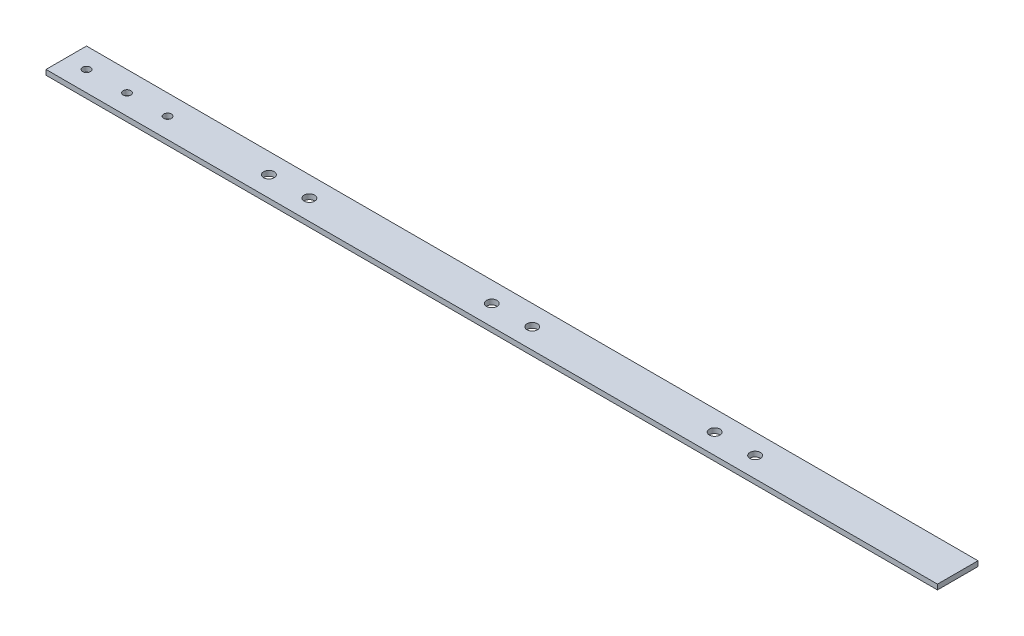
ISO-10303-21;
HEADER;
FILE_DESCRIPTION(('STEP AP214'),'2;1');
FILE_NAME('part.step','',(''),(''),'','','');
FILE_SCHEMA(('AUTOMOTIVE_DESIGN { 1 0 10303 214 1 1 1 1 }'));
ENDSEC;
DATA;
#1=APPLICATION_CONTEXT('core data for automotive mechanical design processes');
#2=APPLICATION_PROTOCOL_DEFINITION('international standard','automotive_design',2000,#1);
#3=PRODUCT_CONTEXT('',#1,'mechanical');
#4=PRODUCT('Part','Part','',(#3));
#5=PRODUCT_RELATED_PRODUCT_CATEGORY('part','',(#4));
#6=PRODUCT_DEFINITION_FORMATION('','',#4);
#7=PRODUCT_DEFINITION_CONTEXT('part definition',#1,'design');
#8=PRODUCT_DEFINITION('design','',#6,#7);
#9=PRODUCT_DEFINITION_SHAPE('','',#8);
#10=(LENGTH_UNIT() NAMED_UNIT(*) SI_UNIT(.MILLI.,.METRE.));
#11=(NAMED_UNIT(*) PLANE_ANGLE_UNIT() SI_UNIT($,.RADIAN.));
#12=(NAMED_UNIT(*) SI_UNIT($,.STERADIAN.) SOLID_ANGLE_UNIT());
#13=UNCERTAINTY_MEASURE_WITH_UNIT(LENGTH_MEASURE(1.E-05),#10,'distance_accuracy_value','');
#14=(GEOMETRIC_REPRESENTATION_CONTEXT(3) GLOBAL_UNCERTAINTY_ASSIGNED_CONTEXT((#13)) GLOBAL_UNIT_ASSIGNED_CONTEXT((#10,
#11,#12)) REPRESENTATION_CONTEXT('',''));
#15=CARTESIAN_POINT('',(0.,0.,0.));
#16=DIRECTION('',(0.,0.,1.));
#17=DIRECTION('',(1.,0.,0.));
#18=AXIS2_PLACEMENT_3D('',#15,#16,#17);
#19=CARTESIAN_POINT('',(279.4,3.175,-12.7));
#20=DIRECTION('',(-1.,0.,0.));
#21=DIRECTION('',(0.,0.,1.));
#22=AXIS2_PLACEMENT_3D('',#19,#20,#21);
#23=PLANE('',#22);
#24=DIRECTION('',(0.,0.,-1.));
#25=VECTOR('',#24,1.);
#26=CARTESIAN_POINT('',(279.4,0.,-12.7));
#27=LINE('',#26,#25);
#28=CARTESIAN_POINT('',(279.4,0.,12.7));
#29=VERTEX_POINT('',#28);
#30=CARTESIAN_POINT('',(279.4,0.,-12.7));
#31=VERTEX_POINT('',#30);
#32=EDGE_CURVE('E100',#29,#31,#27,.T.);
#33=ORIENTED_EDGE('',*,*,#32,.T.);
#34=DIRECTION('',(0.,-1.,0.));
#35=VECTOR('',#34,1.);
#36=CARTESIAN_POINT('',(279.4,3.175,-12.7));
#37=LINE('',#36,#35);
#38=CARTESIAN_POINT('',(279.4,3.175,-12.7));
#39=VERTEX_POINT('',#38);
#40=EDGE_CURVE('E11',#39,#31,#37,.T.);
#41=ORIENTED_EDGE('',*,*,#40,.F.);
#42=DIRECTION('',(0.,0.,-1.));
#43=VECTOR('',#42,1.);
#44=CARTESIAN_POINT('',(279.4,3.175,-12.7));
#45=LINE('',#44,#43);
#46=CARTESIAN_POINT('',(279.4,3.175,12.7));
#47=VERTEX_POINT('',#46);
#48=EDGE_CURVE('E88',#47,#39,#45,.T.);
#49=ORIENTED_EDGE('',*,*,#48,.F.);
#50=DIRECTION('',(0.,-1.,0.));
#51=VECTOR('',#50,1.);
#52=CARTESIAN_POINT('',(279.4,3.175,12.7));
#53=LINE('',#52,#51);
#54=EDGE_CURVE('E96',#47,#29,#53,.T.);
#55=ORIENTED_EDGE('',*,*,#54,.T.);
#56=EDGE_LOOP('',(#33,#41,#49,#55));
#57=FACE_BOUND('',#56,.T.);
#58=ADVANCED_FACE('F37',(#57),#23,.F.);
#59=CARTESIAN_POINT('',(-279.4,3.175,-12.7));
#60=DIRECTION('',(0.,0.,1.));
#61=DIRECTION('',(1.,0.,0.));
#62=AXIS2_PLACEMENT_3D('',#59,#60,#61);
#63=PLANE('',#62);
#64=DIRECTION('',(-1.,0.,0.));
#65=VECTOR('',#64,1.);
#66=CARTESIAN_POINT('',(-279.4,0.,-12.7));
#67=LINE('',#66,#65);
#68=CARTESIAN_POINT('',(-279.4,0.,-12.7));
#69=VERTEX_POINT('',#68);
#70=EDGE_CURVE('E92',#31,#69,#67,.T.);
#71=ORIENTED_EDGE('',*,*,#70,.T.);
#72=DIRECTION('',(0.,-1.,0.));
#73=VECTOR('',#72,1.);
#74=CARTESIAN_POINT('',(-279.4,3.175,-12.7));
#75=LINE('',#74,#73);
#76=CARTESIAN_POINT('',(-279.4,3.175,-12.7));
#77=VERTEX_POINT('',#76);
#78=EDGE_CURVE('E45',#77,#69,#75,.T.);
#79=ORIENTED_EDGE('',*,*,#78,.F.);
#80=DIRECTION('',(-1.,0.,0.));
#81=VECTOR('',#80,1.);
#82=CARTESIAN_POINT('',(-279.4,3.175,-12.7));
#83=LINE('',#82,#81);
#84=EDGE_CURVE('E83',#39,#77,#83,.T.);
#85=ORIENTED_EDGE('',*,*,#84,.F.);
#86=ORIENTED_EDGE('',*,*,#40,.T.);
#87=EDGE_LOOP('',(#71,#79,#85,#86));
#88=FACE_BOUND('',#87,.T.);
#89=ADVANCED_FACE('F91',(#88),#63,.F.);
#90=CARTESIAN_POINT('',(-279.4,3.175,-12.7));
#91=DIRECTION('',(1.,0.,0.));
#92=DIRECTION('',(0.,0.,-1.));
#93=AXIS2_PLACEMENT_3D('',#90,#91,#92);
#94=PLANE('',#93);
#95=DIRECTION('',(0.,0.,1.));
#96=VECTOR('',#95,1.);
#97=CARTESIAN_POINT('',(-279.4,0.,-12.7));
#98=LINE('',#97,#96);
#99=CARTESIAN_POINT('',(-279.4,0.,12.7));
#100=VERTEX_POINT('',#99);
#101=EDGE_CURVE('E70',#69,#100,#98,.T.);
#102=ORIENTED_EDGE('',*,*,#101,.T.);
#103=DIRECTION('',(0.,-1.,0.));
#104=VECTOR('',#103,1.);
#105=CARTESIAN_POINT('',(-279.4,3.175,12.7));
#106=LINE('',#105,#104);
#107=CARTESIAN_POINT('',(-279.4,3.175,12.7));
#108=VERTEX_POINT('',#107);
#109=EDGE_CURVE('E93',#108,#100,#106,.T.);
#110=ORIENTED_EDGE('',*,*,#109,.F.);
#111=DIRECTION('',(0.,0.,1.));
#112=VECTOR('',#111,1.);
#113=CARTESIAN_POINT('',(-279.4,3.175,-12.7));
#114=LINE('',#113,#112);
#115=EDGE_CURVE('E86',#77,#108,#114,.T.);
#116=ORIENTED_EDGE('',*,*,#115,.F.);
#117=ORIENTED_EDGE('',*,*,#78,.T.);
#118=EDGE_LOOP('',(#102,#110,#116,#117));
#119=FACE_BOUND('',#118,.T.);
#120=ADVANCED_FACE('F94',(#119),#94,.F.);
#121=CARTESIAN_POINT('',(-279.4,3.175,12.7));
#122=DIRECTION('',(0.,0.,-1.));
#123=DIRECTION('',(-1.,0.,0.));
#124=AXIS2_PLACEMENT_3D('',#121,#122,#123);
#125=PLANE('',#124);
#126=DIRECTION('',(1.,0.,0.));
#127=VECTOR('',#126,1.);
#128=CARTESIAN_POINT('',(-279.4,0.,12.7));
#129=LINE('',#128,#127);
#130=EDGE_CURVE('E76',#100,#29,#129,.T.);
#131=ORIENTED_EDGE('',*,*,#130,.T.);
#132=ORIENTED_EDGE('',*,*,#54,.F.);
#133=DIRECTION('',(1.,0.,0.));
#134=VECTOR('',#133,1.);
#135=CARTESIAN_POINT('',(-279.4,3.175,12.7));
#136=LINE('',#135,#134);
#137=EDGE_CURVE('E53',#108,#47,#136,.T.);
#138=ORIENTED_EDGE('',*,*,#137,.F.);
#139=ORIENTED_EDGE('',*,*,#109,.T.);
#140=EDGE_LOOP('',(#131,#132,#138,#139));
#141=FACE_BOUND('',#140,.T.);
#142=ADVANCED_FACE('F108',(#141),#125,.F.);
#143=CARTESIAN_POINT('',(0.,3.175,0.));
#144=DIRECTION('',(0.,1.,0.));
#145=DIRECTION('',(0.,0.,1.));
#146=AXIS2_PLACEMENT_3D('',#143,#144,#145);
#147=PLANE('',#146);
#148=CARTESIAN_POINT('',(-152.4,3.175,0.));
#149=DIRECTION('',(0.,1.,0.));
#150=DIRECTION('',(0.,0.,1.));
#151=AXIS2_PLACEMENT_3D('',#148,#149,#150);
#152=CIRCLE('',#151,3.30200000000001);
#153=CARTESIAN_POINT('',(-152.4,3.175,3.30200000000001));
#154=VERTEX_POINT('',#153);
#155=EDGE_CURVE('E162',#154,#154,#152,.T.);
#156=ORIENTED_EDGE('',*,*,#155,.F.);
#157=EDGE_LOOP('',(#156));
#158=FACE_BOUND('',#157,.T.);
#159=CARTESIAN_POINT('',(-127.,3.175,0.));
#160=DIRECTION('',(0.,1.,0.));
#161=DIRECTION('',(0.,0.,1.));
#162=AXIS2_PLACEMENT_3D('',#159,#160,#161);
#163=CIRCLE('',#162,3.302);
#164=CARTESIAN_POINT('',(-127.,3.175,3.302));
#165=VERTEX_POINT('',#164);
#166=EDGE_CURVE('E159',#165,#165,#163,.T.);
#167=ORIENTED_EDGE('',*,*,#166,.F.);
#168=EDGE_LOOP('',(#167));
#169=FACE_BOUND('',#168,.T.);
#170=CARTESIAN_POINT('',(-12.7,3.175,0.));
#171=DIRECTION('',(0.,1.,0.));
#172=DIRECTION('',(0.,0.,1.));
#173=AXIS2_PLACEMENT_3D('',#170,#171,#172);
#174=CIRCLE('',#173,3.302);
#175=CARTESIAN_POINT('',(-12.7,3.175,3.302));
#176=VERTEX_POINT('',#175);
#177=EDGE_CURVE('E153',#176,#176,#174,.T.);
#178=ORIENTED_EDGE('',*,*,#177,.F.);
#179=EDGE_LOOP('',(#178));
#180=FACE_BOUND('',#179,.T.);
#181=CARTESIAN_POINT('',(12.7,3.175,0.));
#182=DIRECTION('',(0.,1.,0.));
#183=DIRECTION('',(0.,0.,1.));
#184=AXIS2_PLACEMENT_3D('',#181,#182,#183);
#185=CIRCLE('',#184,3.302);
#186=CARTESIAN_POINT('',(12.7,3.175,3.302));
#187=VERTEX_POINT('',#186);
#188=EDGE_CURVE('E147',#187,#187,#185,.T.);
#189=ORIENTED_EDGE('',*,*,#188,.F.);
#190=EDGE_LOOP('',(#189));
#191=FACE_BOUND('',#190,.T.);
#192=CARTESIAN_POINT('',(127.,3.175,0.));
#193=DIRECTION('',(0.,1.,0.));
#194=DIRECTION('',(0.,0.,1.));
#195=AXIS2_PLACEMENT_3D('',#192,#193,#194);
#196=CIRCLE('',#195,3.30200000000001);
#197=CARTESIAN_POINT('',(127.,3.175,3.30200000000001));
#198=VERTEX_POINT('',#197);
#199=EDGE_CURVE('E141',#198,#198,#196,.T.);
#200=ORIENTED_EDGE('',*,*,#199,.F.);
#201=EDGE_LOOP('',(#200));
#202=FACE_BOUND('',#201,.T.);
#203=CARTESIAN_POINT('',(152.4,3.175,0.));
#204=DIRECTION('',(0.,1.,0.));
#205=DIRECTION('',(0.,0.,1.));
#206=AXIS2_PLACEMENT_3D('',#203,#204,#205);
#207=CIRCLE('',#206,3.30200000000001);
#208=CARTESIAN_POINT('',(152.4,3.175,3.30200000000001));
#209=VERTEX_POINT('',#208);
#210=EDGE_CURVE('E135',#209,#209,#207,.T.);
#211=ORIENTED_EDGE('',*,*,#210,.F.);
#212=EDGE_LOOP('',(#211));
#213=FACE_BOUND('',#212,.T.);
#214=CARTESIAN_POINT('',(-266.7,3.175,0.));
#215=DIRECTION('',(0.,1.,0.));
#216=DIRECTION('',(0.,0.,1.));
#217=AXIS2_PLACEMENT_3D('',#214,#215,#216);
#218=CIRCLE('',#217,2.413);
#219=CARTESIAN_POINT('',(-266.7,3.175,2.413));
#220=VERTEX_POINT('',#219);
#221=EDGE_CURVE('E127',#220,#220,#218,.T.);
#222=ORIENTED_EDGE('',*,*,#221,.F.);
#223=EDGE_LOOP('',(#222));
#224=FACE_BOUND('',#223,.T.);
#225=CARTESIAN_POINT('',(-241.3,3.175,0.));
#226=DIRECTION('',(0.,1.,0.));
#227=DIRECTION('',(0.,0.,1.));
#228=AXIS2_PLACEMENT_3D('',#225,#226,#227);
#229=CIRCLE('',#228,2.413);
#230=CARTESIAN_POINT('',(-241.3,3.175,2.413));
#231=VERTEX_POINT('',#230);
#232=EDGE_CURVE('E124',#231,#231,#229,.T.);
#233=ORIENTED_EDGE('',*,*,#232,.F.);
#234=EDGE_LOOP('',(#233));
#235=FACE_BOUND('',#234,.T.);
#236=CARTESIAN_POINT('',(-215.9,3.175,0.));
#237=DIRECTION('',(0.,1.,0.));
#238=DIRECTION('',(0.,0.,1.));
#239=AXIS2_PLACEMENT_3D('',#236,#237,#238);
#240=CIRCLE('',#239,2.413);
#241=CARTESIAN_POINT('',(-215.9,3.175,2.413));
#242=VERTEX_POINT('',#241);
#243=EDGE_CURVE('E117',#242,#242,#240,.T.);
#244=ORIENTED_EDGE('',*,*,#243,.F.);
#245=EDGE_LOOP('',(#244));
#246=FACE_BOUND('',#245,.T.);
#247=ORIENTED_EDGE('',*,*,#48,.T.);
#248=ORIENTED_EDGE('',*,*,#84,.T.);
#249=ORIENTED_EDGE('',*,*,#115,.T.);
#250=ORIENTED_EDGE('',*,*,#137,.T.);
#251=EDGE_LOOP('',(#247,#248,#249,#250));
#252=FACE_BOUND('',#251,.T.);
#253=ADVANCED_FACE('F84',(#158,#169,#180,#191,#202,#213,#224,#235,#246,#252),#147,.T.);
#254=CARTESIAN_POINT('',(0.,0.,0.));
#255=DIRECTION('',(0.,1.,0.));
#256=DIRECTION('',(0.,0.,1.));
#257=AXIS2_PLACEMENT_3D('',#254,#255,#256);
#258=PLANE('',#257);
#259=CARTESIAN_POINT('',(-152.4,0.,0.));
#260=DIRECTION('',(0.,1.,0.));
#261=DIRECTION('',(0.,0.,1.));
#262=AXIS2_PLACEMENT_3D('',#259,#260,#261);
#263=CIRCLE('',#262,3.30200000000001);
#264=CARTESIAN_POINT('',(-152.4,0.,3.30200000000001));
#265=VERTEX_POINT('',#264);
#266=EDGE_CURVE('E118',#265,#265,#263,.T.);
#267=ORIENTED_EDGE('',*,*,#266,.T.);
#268=EDGE_LOOP('',(#267));
#269=FACE_BOUND('',#268,.T.);
#270=CARTESIAN_POINT('',(-127.,0.,0.));
#271=DIRECTION('',(0.,1.,0.));
#272=DIRECTION('',(0.,0.,1.));
#273=AXIS2_PLACEMENT_3D('',#270,#271,#272);
#274=CIRCLE('',#273,3.302);
#275=CARTESIAN_POINT('',(-127.,0.,3.302));
#276=VERTEX_POINT('',#275);
#277=EDGE_CURVE('E156',#276,#276,#274,.T.);
#278=ORIENTED_EDGE('',*,*,#277,.T.);
#279=EDGE_LOOP('',(#278));
#280=FACE_BOUND('',#279,.T.);
#281=CARTESIAN_POINT('',(-12.7,0.,0.));
#282=DIRECTION('',(0.,1.,0.));
#283=DIRECTION('',(0.,0.,1.));
#284=AXIS2_PLACEMENT_3D('',#281,#282,#283);
#285=CIRCLE('',#284,3.302);
#286=CARTESIAN_POINT('',(-12.7,0.,3.302));
#287=VERTEX_POINT('',#286);
#288=EDGE_CURVE('E150',#287,#287,#285,.T.);
#289=ORIENTED_EDGE('',*,*,#288,.T.);
#290=EDGE_LOOP('',(#289));
#291=FACE_BOUND('',#290,.T.);
#292=CARTESIAN_POINT('',(12.7,0.,0.));
#293=DIRECTION('',(0.,1.,0.));
#294=DIRECTION('',(0.,0.,1.));
#295=AXIS2_PLACEMENT_3D('',#292,#293,#294);
#296=CIRCLE('',#295,3.302);
#297=CARTESIAN_POINT('',(12.7,0.,3.302));
#298=VERTEX_POINT('',#297);
#299=EDGE_CURVE('E144',#298,#298,#296,.T.);
#300=ORIENTED_EDGE('',*,*,#299,.T.);
#301=EDGE_LOOP('',(#300));
#302=FACE_BOUND('',#301,.T.);
#303=CARTESIAN_POINT('',(127.,0.,0.));
#304=DIRECTION('',(0.,1.,0.));
#305=DIRECTION('',(0.,0.,1.));
#306=AXIS2_PLACEMENT_3D('',#303,#304,#305);
#307=CIRCLE('',#306,3.30200000000001);
#308=CARTESIAN_POINT('',(127.,0.,3.30200000000001));
#309=VERTEX_POINT('',#308);
#310=EDGE_CURVE('E138',#309,#309,#307,.T.);
#311=ORIENTED_EDGE('',*,*,#310,.T.);
#312=EDGE_LOOP('',(#311));
#313=FACE_BOUND('',#312,.T.);
#314=CARTESIAN_POINT('',(152.4,0.,0.));
#315=DIRECTION('',(0.,1.,0.));
#316=DIRECTION('',(0.,0.,1.));
#317=AXIS2_PLACEMENT_3D('',#314,#315,#316);
#318=CIRCLE('',#317,3.30200000000001);
#319=CARTESIAN_POINT('',(152.4,0.,3.30200000000001));
#320=VERTEX_POINT('',#319);
#321=EDGE_CURVE('E132',#320,#320,#318,.T.);
#322=ORIENTED_EDGE('',*,*,#321,.T.);
#323=EDGE_LOOP('',(#322));
#324=FACE_BOUND('',#323,.T.);
#325=CARTESIAN_POINT('',(-266.7,0.,0.));
#326=DIRECTION('',(0.,1.,0.));
#327=DIRECTION('',(0.,0.,1.));
#328=AXIS2_PLACEMENT_3D('',#325,#326,#327);
#329=CIRCLE('',#328,2.413);
#330=CARTESIAN_POINT('',(-266.7,0.,2.413));
#331=VERTEX_POINT('',#330);
#332=EDGE_CURVE('E103',#331,#331,#329,.T.);
#333=ORIENTED_EDGE('',*,*,#332,.T.);
#334=EDGE_LOOP('',(#333));
#335=FACE_BOUND('',#334,.T.);
#336=CARTESIAN_POINT('',(-241.3,0.,0.));
#337=DIRECTION('',(0.,1.,0.));
#338=DIRECTION('',(0.,0.,1.));
#339=AXIS2_PLACEMENT_3D('',#336,#337,#338);
#340=CIRCLE('',#339,2.413);
#341=CARTESIAN_POINT('',(-241.3,0.,2.413));
#342=VERTEX_POINT('',#341);
#343=EDGE_CURVE('E121',#342,#342,#340,.T.);
#344=ORIENTED_EDGE('',*,*,#343,.T.);
#345=EDGE_LOOP('',(#344));
#346=FACE_BOUND('',#345,.T.);
#347=CARTESIAN_POINT('',(-215.9,0.,0.));
#348=DIRECTION('',(0.,1.,0.));
#349=DIRECTION('',(0.,0.,1.));
#350=AXIS2_PLACEMENT_3D('',#347,#348,#349);
#351=CIRCLE('',#350,2.413);
#352=CARTESIAN_POINT('',(-215.9,0.,2.413));
#353=VERTEX_POINT('',#352);
#354=EDGE_CURVE('E114',#353,#353,#351,.T.);
#355=ORIENTED_EDGE('',*,*,#354,.T.);
#356=EDGE_LOOP('',(#355));
#357=FACE_BOUND('',#356,.T.);
#358=ORIENTED_EDGE('',*,*,#32,.F.);
#359=ORIENTED_EDGE('',*,*,#130,.F.);
#360=ORIENTED_EDGE('',*,*,#101,.F.);
#361=ORIENTED_EDGE('',*,*,#70,.F.);
#362=EDGE_LOOP('',(#358,#359,#360,#361));
#363=FACE_BOUND('',#362,.T.);
#364=ADVANCED_FACE('F111',(#269,#280,#291,#302,#313,#324,#335,#346,#357,#363),#258,.F.);
#365=CARTESIAN_POINT('',(-215.9,0.,0.));
#366=DIRECTION('',(0.,1.,0.));
#367=DIRECTION('',(0.,0.,1.));
#368=AXIS2_PLACEMENT_3D('',#365,#366,#367);
#369=CYLINDRICAL_SURFACE('',#368,2.413);
#370=ORIENTED_EDGE('',*,*,#354,.F.);
#371=EDGE_LOOP('',(#370));
#372=FACE_BOUND('',#371,.T.);
#373=ORIENTED_EDGE('',*,*,#243,.T.);
#374=EDGE_LOOP('',(#373));
#375=FACE_BOUND('',#374,.T.);
#376=ADVANCED_FACE('F196',(#372,#375),#369,.F.);
#377=CARTESIAN_POINT('',(-241.3,0.,0.));
#378=DIRECTION('',(0.,1.,0.));
#379=DIRECTION('',(0.,0.,1.));
#380=AXIS2_PLACEMENT_3D('',#377,#378,#379);
#381=CYLINDRICAL_SURFACE('',#380,2.413);
#382=ORIENTED_EDGE('',*,*,#343,.F.);
#383=EDGE_LOOP('',(#382));
#384=FACE_BOUND('',#383,.T.);
#385=ORIENTED_EDGE('',*,*,#232,.T.);
#386=EDGE_LOOP('',(#385));
#387=FACE_BOUND('',#386,.T.);
#388=ADVANCED_FACE('F198',(#384,#387),#381,.F.);
#389=CARTESIAN_POINT('',(-266.7,0.,0.));
#390=DIRECTION('',(0.,1.,0.));
#391=DIRECTION('',(0.,0.,1.));
#392=AXIS2_PLACEMENT_3D('',#389,#390,#391);
#393=CYLINDRICAL_SURFACE('',#392,2.413);
#394=ORIENTED_EDGE('',*,*,#332,.F.);
#395=EDGE_LOOP('',(#394));
#396=FACE_BOUND('',#395,.T.);
#397=ORIENTED_EDGE('',*,*,#221,.T.);
#398=EDGE_LOOP('',(#397));
#399=FACE_BOUND('',#398,.T.);
#400=ADVANCED_FACE('F205',(#396,#399),#393,.F.);
#401=CARTESIAN_POINT('',(152.4,0.,0.));
#402=DIRECTION('',(0.,1.,0.));
#403=DIRECTION('',(0.,0.,1.));
#404=AXIS2_PLACEMENT_3D('',#401,#402,#403);
#405=CYLINDRICAL_SURFACE('',#404,3.30200000000001);
#406=ORIENTED_EDGE('',*,*,#321,.F.);
#407=EDGE_LOOP('',(#406));
#408=FACE_BOUND('',#407,.T.);
#409=ORIENTED_EDGE('',*,*,#210,.T.);
#410=EDGE_LOOP('',(#409));
#411=FACE_BOUND('',#410,.T.);
#412=ADVANCED_FACE('F243',(#408,#411),#405,.F.);
#413=CARTESIAN_POINT('',(127.,0.,0.));
#414=DIRECTION('',(0.,1.,0.));
#415=DIRECTION('',(0.,0.,1.));
#416=AXIS2_PLACEMENT_3D('',#413,#414,#415);
#417=CYLINDRICAL_SURFACE('',#416,3.30200000000001);
#418=ORIENTED_EDGE('',*,*,#310,.F.);
#419=EDGE_LOOP('',(#418));
#420=FACE_BOUND('',#419,.T.);
#421=ORIENTED_EDGE('',*,*,#199,.T.);
#422=EDGE_LOOP('',(#421));
#423=FACE_BOUND('',#422,.T.);
#424=ADVANCED_FACE('F248',(#420,#423),#417,.F.);
#425=CARTESIAN_POINT('',(12.7,0.,0.));
#426=DIRECTION('',(0.,1.,0.));
#427=DIRECTION('',(0.,0.,1.));
#428=AXIS2_PLACEMENT_3D('',#425,#426,#427);
#429=CYLINDRICAL_SURFACE('',#428,3.302);
#430=ORIENTED_EDGE('',*,*,#299,.F.);
#431=EDGE_LOOP('',(#430));
#432=FACE_BOUND('',#431,.T.);
#433=ORIENTED_EDGE('',*,*,#188,.T.);
#434=EDGE_LOOP('',(#433));
#435=FACE_BOUND('',#434,.T.);
#436=ADVANCED_FACE('F261',(#432,#435),#429,.F.);
#437=CARTESIAN_POINT('',(-12.7,0.,0.));
#438=DIRECTION('',(0.,1.,0.));
#439=DIRECTION('',(0.,0.,1.));
#440=AXIS2_PLACEMENT_3D('',#437,#438,#439);
#441=CYLINDRICAL_SURFACE('',#440,3.302);
#442=ORIENTED_EDGE('',*,*,#288,.F.);
#443=EDGE_LOOP('',(#442));
#444=FACE_BOUND('',#443,.T.);
#445=ORIENTED_EDGE('',*,*,#177,.T.);
#446=EDGE_LOOP('',(#445));
#447=FACE_BOUND('',#446,.T.);
#448=ADVANCED_FACE('F272',(#444,#447),#441,.F.);
#449=CARTESIAN_POINT('',(-127.,0.,0.));
#450=DIRECTION('',(0.,1.,0.));
#451=DIRECTION('',(0.,0.,1.));
#452=AXIS2_PLACEMENT_3D('',#449,#450,#451);
#453=CYLINDRICAL_SURFACE('',#452,3.302);
#454=ORIENTED_EDGE('',*,*,#277,.F.);
#455=EDGE_LOOP('',(#454));
#456=FACE_BOUND('',#455,.T.);
#457=ORIENTED_EDGE('',*,*,#166,.T.);
#458=EDGE_LOOP('',(#457));
#459=FACE_BOUND('',#458,.T.);
#460=ADVANCED_FACE('F173',(#456,#459),#453,.F.);
#461=CARTESIAN_POINT('',(-152.4,0.,0.));
#462=DIRECTION('',(0.,1.,0.));
#463=DIRECTION('',(0.,0.,1.));
#464=AXIS2_PLACEMENT_3D('',#461,#462,#463);
#465=CYLINDRICAL_SURFACE('',#464,3.30200000000001);
#466=ORIENTED_EDGE('',*,*,#266,.F.);
#467=EDGE_LOOP('',(#466));
#468=FACE_BOUND('',#467,.T.);
#469=ORIENTED_EDGE('',*,*,#155,.T.);
#470=EDGE_LOOP('',(#469));
#471=FACE_BOUND('',#470,.T.);
#472=ADVANCED_FACE('F170',(#468,#471),#465,.F.);
#473=CLOSED_SHELL('',(#58,#89,#120,#142,#253,#364,#376,#388,#400,#412,#424,#436,#448,#460,#472));
#474=MANIFOLD_SOLID_BREP('B2',#473);
#475=ADVANCED_BREP_SHAPE_REPRESENTATION('',(#18,#474),#14);
#476=SHAPE_DEFINITION_REPRESENTATION(#9,#475);
ENDSEC;
END-ISO-10303-21;
